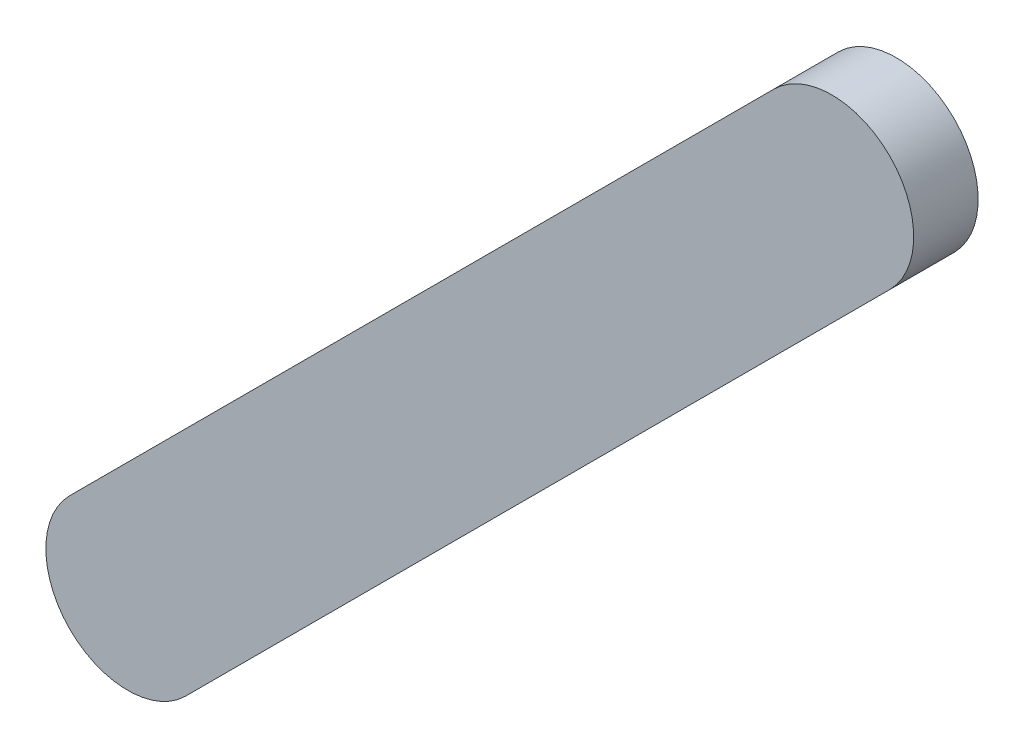
ISO-10303-21;
HEADER;
FILE_DESCRIPTION(('STEP AP214'),'2;1');
FILE_NAME('part.step','',(''),(''),'','','');
FILE_SCHEMA(('AUTOMOTIVE_DESIGN { 1 0 10303 214 1 1 1 1 }'));
ENDSEC;
DATA;
#1=APPLICATION_CONTEXT('core data for automotive mechanical design processes');
#2=APPLICATION_PROTOCOL_DEFINITION('international standard','automotive_design',2000,#1);
#3=PRODUCT_CONTEXT('',#1,'mechanical');
#4=PRODUCT('Part','Part','',(#3));
#5=PRODUCT_RELATED_PRODUCT_CATEGORY('part','',(#4));
#6=PRODUCT_DEFINITION_FORMATION('','',#4);
#7=PRODUCT_DEFINITION_CONTEXT('part definition',#1,'design');
#8=PRODUCT_DEFINITION('design','',#6,#7);
#9=PRODUCT_DEFINITION_SHAPE('','',#8);
#10=(LENGTH_UNIT() NAMED_UNIT(*) SI_UNIT(.MILLI.,.METRE.));
#11=(NAMED_UNIT(*) PLANE_ANGLE_UNIT() SI_UNIT($,.RADIAN.));
#12=(NAMED_UNIT(*) SI_UNIT($,.STERADIAN.) SOLID_ANGLE_UNIT());
#13=UNCERTAINTY_MEASURE_WITH_UNIT(LENGTH_MEASURE(1.E-05),#10,'distance_accuracy_value','');
#14=(GEOMETRIC_REPRESENTATION_CONTEXT(3) GLOBAL_UNCERTAINTY_ASSIGNED_CONTEXT((#13)) GLOBAL_UNIT_ASSIGNED_CONTEXT((#10,
#11,#12)) REPRESENTATION_CONTEXT('',''));
#15=CARTESIAN_POINT('',(0.,0.,0.));
#16=DIRECTION('',(0.,0.,1.));
#17=DIRECTION('',(1.,0.,0.));
#18=AXIS2_PLACEMENT_3D('',#15,#16,#17);
#19=CARTESIAN_POINT('',(138.86360594,117.47319406,0.));
#20=DIRECTION('',(-0.707106781186545,0.70710678118655,0.));
#21=DIRECTION('',(0.70710678118655,0.707106781186545,0.));
#22=AXIS2_PLACEMENT_3D('',#19,#20,#21);
#23=PLANE('',#22);
#24=DIRECTION('',(0.70710678118655,0.707106781186545,0.));
#25=VECTOR('',#24,1.);
#26=CARTESIAN_POINT('',(138.86360594,117.47319406,0.1999996));
#27=LINE('',#26,#25);
#28=CARTESIAN_POINT('',(138.86360594,117.47319406,0.1999996));
#29=VERTEX_POINT('',#28);
#30=CARTESIAN_POINT('',(141.04800594,119.65759406,0.1999996));
#31=VERTEX_POINT('',#30);
#32=EDGE_CURVE('E11',#29,#31,#27,.T.);
#33=ORIENTED_EDGE('',*,*,#32,.F.);
#34=DIRECTION('',(0.,0.,1.));
#35=VECTOR('',#34,1.);
#36=CARTESIAN_POINT('',(138.86360594,117.47319406,0.));
#37=LINE('',#36,#35);
#38=CARTESIAN_POINT('',(138.86360594,117.47319406,0.));
#39=VERTEX_POINT('',#38);
#40=EDGE_CURVE('E24',#39,#29,#37,.T.);
#41=ORIENTED_EDGE('',*,*,#40,.F.);
#42=DIRECTION('',(0.70710678118655,0.707106781186545,0.));
#43=VECTOR('',#42,1.);
#44=CARTESIAN_POINT('',(138.86360594,117.47319406,0.));
#45=LINE('',#44,#43);
#46=CARTESIAN_POINT('',(141.04800594,119.65759406,0.));
#47=VERTEX_POINT('',#46);
#48=EDGE_CURVE('E75',#39,#47,#45,.T.);
#49=ORIENTED_EDGE('',*,*,#48,.T.);
#50=DIRECTION('',(0.,0.,1.));
#51=VECTOR('',#50,1.);
#52=CARTESIAN_POINT('',(141.04800594,119.65759406,0.));
#53=LINE('',#52,#51);
#54=EDGE_CURVE('E37',#47,#31,#53,.T.);
#55=ORIENTED_EDGE('',*,*,#54,.T.);
#56=EDGE_LOOP('',(#33,#41,#49,#55));
#57=FACE_BOUND('',#56,.T.);
#58=ADVANCED_FACE('F17',(#57),#23,.F.);
#59=CARTESIAN_POINT('',(140.8684,119.8372,0.));
#60=DIRECTION('',(0.,0.,-1.));
#61=DIRECTION('',(0.707106781186492,-0.707106781186604,0.));
#62=AXIS2_PLACEMENT_3D('',#59,#60,#61);
#63=CYLINDRICAL_SURFACE('',#62,0.254001156230771);
#64=CARTESIAN_POINT('',(140.8684,119.8372,0.1999996));
#65=DIRECTION('',(0.,0.,1.));
#66=DIRECTION('',(0.707106781186492,-0.707106781186604,0.));
#67=AXIS2_PLACEMENT_3D('',#64,#65,#66);
#68=CIRCLE('',#67,0.254001156230771);
#69=CARTESIAN_POINT('',(140.68879406,120.01680594,0.1999996));
#70=VERTEX_POINT('',#69);
#71=EDGE_CURVE('E83',#31,#70,#68,.T.);
#72=ORIENTED_EDGE('',*,*,#71,.F.);
#73=ORIENTED_EDGE('',*,*,#54,.F.);
#74=CARTESIAN_POINT('',(140.8684,119.8372,0.));
#75=DIRECTION('',(0.,0.,1.));
#76=DIRECTION('',(0.707106781186492,-0.707106781186604,0.));
#77=AXIS2_PLACEMENT_3D('',#74,#75,#76);
#78=CIRCLE('',#77,0.254001156230771);
#79=CARTESIAN_POINT('',(140.68879406,120.01680594,0.));
#80=VERTEX_POINT('',#79);
#81=EDGE_CURVE('E81',#47,#80,#78,.T.);
#82=ORIENTED_EDGE('',*,*,#81,.T.);
#83=DIRECTION('',(0.,0.,1.));
#84=VECTOR('',#83,1.);
#85=CARTESIAN_POINT('',(140.68879406,120.01680594,0.));
#86=LINE('',#85,#84);
#87=EDGE_CURVE('E67',#80,#70,#86,.T.);
#88=ORIENTED_EDGE('',*,*,#87,.T.);
#89=EDGE_LOOP('',(#72,#73,#82,#88));
#90=FACE_BOUND('',#89,.T.);
#91=ADVANCED_FACE('F89',(#90),#63,.T.);
#92=CARTESIAN_POINT('',(140.68879406,120.01680594,0.));
#93=DIRECTION('',(0.707106781186548,-0.707106781186548,0.));
#94=DIRECTION('',(-0.707106781186548,-0.707106781186548,0.));
#95=AXIS2_PLACEMENT_3D('',#92,#93,#94);
#96=PLANE('',#95);
#97=DIRECTION('',(-0.707106781186548,-0.707106781186548,0.));
#98=VECTOR('',#97,1.);
#99=CARTESIAN_POINT('',(140.68879406,120.01680594,0.1999996));
#100=LINE('',#99,#98);
#101=CARTESIAN_POINT('',(138.50439406,117.83240594,0.1999996));
#102=VERTEX_POINT('',#101);
#103=EDGE_CURVE('E71',#70,#102,#100,.T.);
#104=ORIENTED_EDGE('',*,*,#103,.F.);
#105=ORIENTED_EDGE('',*,*,#87,.F.);
#106=DIRECTION('',(-0.707106781186548,-0.707106781186548,0.));
#107=VECTOR('',#106,1.);
#108=CARTESIAN_POINT('',(140.68879406,120.01680594,0.));
#109=LINE('',#108,#107);
#110=CARTESIAN_POINT('',(138.50439406,117.83240594,0.));
#111=VERTEX_POINT('',#110);
#112=EDGE_CURVE('E63',#80,#111,#109,.T.);
#113=ORIENTED_EDGE('',*,*,#112,.T.);
#114=DIRECTION('',(0.,0.,1.));
#115=VECTOR('',#114,1.);
#116=CARTESIAN_POINT('',(138.50439406,117.83240594,0.));
#117=LINE('',#116,#115);
#118=EDGE_CURVE('E53',#111,#102,#117,.T.);
#119=ORIENTED_EDGE('',*,*,#118,.T.);
#120=EDGE_LOOP('',(#104,#105,#113,#119));
#121=FACE_BOUND('',#120,.T.);
#122=ADVANCED_FACE('F66',(#121),#96,.F.);
#123=CARTESIAN_POINT('',(138.684,117.6528,0.));
#124=DIRECTION('',(0.,0.,-1.));
#125=DIRECTION('',(-0.70710678118652,0.707106781186576,0.));
#126=AXIS2_PLACEMENT_3D('',#123,#124,#125);
#127=CYLINDRICAL_SURFACE('',#126,0.254001156230768);
#128=CARTESIAN_POINT('',(138.684,117.6528,0.1999996));
#129=DIRECTION('',(0.,0.,1.));
#130=DIRECTION('',(-0.70710678118652,0.707106781186576,0.));
#131=AXIS2_PLACEMENT_3D('',#128,#129,#130);
#132=CIRCLE('',#131,0.254001156230768);
#133=EDGE_CURVE('E59',#102,#29,#132,.T.);
#134=ORIENTED_EDGE('',*,*,#133,.F.);
#135=ORIENTED_EDGE('',*,*,#118,.F.);
#136=CARTESIAN_POINT('',(138.684,117.6528,0.));
#137=DIRECTION('',(0.,0.,1.));
#138=DIRECTION('',(-0.70710678118652,0.707106781186576,0.));
#139=AXIS2_PLACEMENT_3D('',#136,#137,#138);
#140=CIRCLE('',#139,0.254001156230768);
#141=EDGE_CURVE('E57',#111,#39,#140,.T.);
#142=ORIENTED_EDGE('',*,*,#141,.T.);
#143=ORIENTED_EDGE('',*,*,#40,.T.);
#144=EDGE_LOOP('',(#134,#135,#142,#143));
#145=FACE_BOUND('',#144,.T.);
#146=ADVANCED_FACE('F55',(#145),#127,.T.);
#147=CARTESIAN_POINT('',(138.86360594,117.47319406,0.));
#148=DIRECTION('',(0.,0.,-1.));
#149=DIRECTION('',(-1.,0.,0.));
#150=AXIS2_PLACEMENT_3D('',#147,#148,#149);
#151=PLANE('',#150);
#152=ORIENTED_EDGE('',*,*,#141,.F.);
#153=ORIENTED_EDGE('',*,*,#112,.F.);
#154=ORIENTED_EDGE('',*,*,#81,.F.);
#155=ORIENTED_EDGE('',*,*,#48,.F.);
#156=EDGE_LOOP('',(#152,#153,#154,#155));
#157=FACE_BOUND('',#156,.T.);
#158=ADVANCED_FACE('F74',(#157),#151,.T.);
#159=CARTESIAN_POINT('',(138.86360594,117.47319406,0.1999996));
#160=DIRECTION('',(0.,0.,-1.));
#161=DIRECTION('',(-1.,0.,0.));
#162=AXIS2_PLACEMENT_3D('',#159,#160,#161);
#163=PLANE('',#162);
#164=ORIENTED_EDGE('',*,*,#32,.T.);
#165=ORIENTED_EDGE('',*,*,#71,.T.);
#166=ORIENTED_EDGE('',*,*,#103,.T.);
#167=ORIENTED_EDGE('',*,*,#133,.T.);
#168=EDGE_LOOP('',(#164,#165,#166,#167));
#169=FACE_BOUND('',#168,.T.);
#170=ADVANCED_FACE('F91',(#169),#163,.F.);
#171=CLOSED_SHELL('',(#58,#91,#122,#146,#158,#170));
#172=MANIFOLD_SOLID_BREP('B1',#171);
#173=ADVANCED_BREP_SHAPE_REPRESENTATION('',(#18,#172),#14);
#174=SHAPE_DEFINITION_REPRESENTATION(#9,#173);
ENDSEC;
END-ISO-10303-21;
